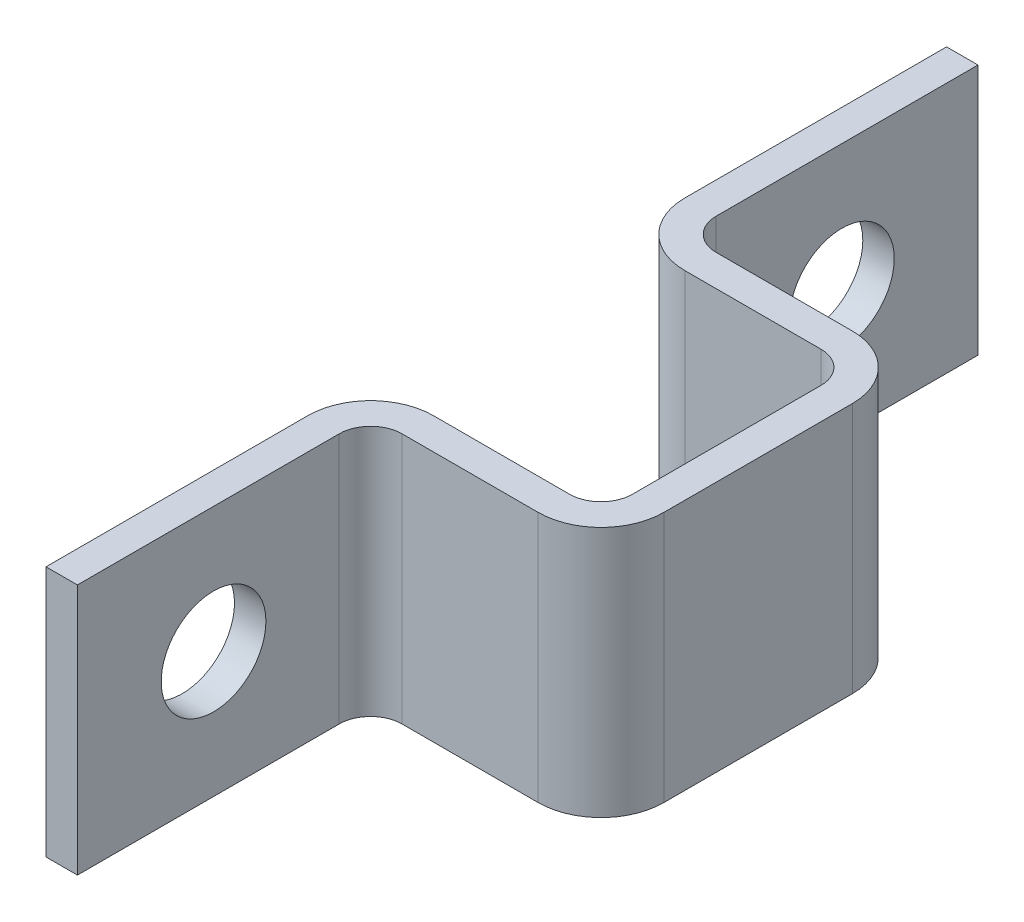
ISO-10303-21;
HEADER;
FILE_DESCRIPTION(('STEP AP214'),'2;1');
FILE_NAME('part.step','',(''),(''),'','','');
FILE_SCHEMA(('AUTOMOTIVE_DESIGN { 1 0 10303 214 1 1 1 1 }'));
ENDSEC;
DATA;
#1=APPLICATION_CONTEXT('core data for automotive mechanical design processes');
#2=APPLICATION_PROTOCOL_DEFINITION('international standard','automotive_design',2000,#1);
#3=PRODUCT_CONTEXT('',#1,'mechanical');
#4=PRODUCT('Part','Part','',(#3));
#5=PRODUCT_RELATED_PRODUCT_CATEGORY('part','',(#4));
#6=PRODUCT_DEFINITION_FORMATION('','',#4);
#7=PRODUCT_DEFINITION_CONTEXT('part definition',#1,'design');
#8=PRODUCT_DEFINITION('design','',#6,#7);
#9=PRODUCT_DEFINITION_SHAPE('','',#8);
#10=(LENGTH_UNIT() NAMED_UNIT(*) SI_UNIT(.MILLI.,.METRE.));
#11=(NAMED_UNIT(*) PLANE_ANGLE_UNIT() SI_UNIT($,.RADIAN.));
#12=(NAMED_UNIT(*) SI_UNIT($,.STERADIAN.) SOLID_ANGLE_UNIT());
#13=UNCERTAINTY_MEASURE_WITH_UNIT(LENGTH_MEASURE(1.E-05),#10,'distance_accuracy_value','');
#14=(GEOMETRIC_REPRESENTATION_CONTEXT(3) GLOBAL_UNCERTAINTY_ASSIGNED_CONTEXT((#13)) GLOBAL_UNIT_ASSIGNED_CONTEXT((#10,
#11,#12)) REPRESENTATION_CONTEXT('',''));
#15=CARTESIAN_POINT('',(0.,0.,0.));
#16=DIRECTION('',(0.,0.,1.));
#17=DIRECTION('',(1.,0.,0.));
#18=AXIS2_PLACEMENT_3D('',#15,#16,#17);
#19=CARTESIAN_POINT('',(1.5,12.,-21.5));
#20=DIRECTION('',(1.,0.,0.));
#21=DIRECTION('',(0.,0.,-1.));
#22=AXIS2_PLACEMENT_3D('',#19,#20,#21);
#23=PLANE('',#22);
#24=DIRECTION('',(0.,0.,1.));
#25=VECTOR('',#24,1.);
#26=CARTESIAN_POINT('',(1.5,0.,-21.5));
#27=LINE('',#26,#25);
#28=CARTESIAN_POINT('',(1.5,0.,-21.5));
#29=VERTEX_POINT('',#28);
#30=CARTESIAN_POINT('',(1.5,0.,-9.));
#31=VERTEX_POINT('',#30);
#32=EDGE_CURVE('E233',#29,#31,#27,.T.);
#33=ORIENTED_EDGE('',*,*,#32,.F.);
#34=DIRECTION('',(0.,-1.,0.));
#35=VECTOR('',#34,1.);
#36=CARTESIAN_POINT('',(1.5,12.,-21.5));
#37=LINE('',#36,#35);
#38=CARTESIAN_POINT('',(1.5,12.,-21.5));
#39=VERTEX_POINT('',#38);
#40=EDGE_CURVE('E269',#39,#29,#37,.T.);
#41=ORIENTED_EDGE('',*,*,#40,.F.);
#42=DIRECTION('',(0.,0.,1.));
#43=VECTOR('',#42,1.);
#44=CARTESIAN_POINT('',(1.5,12.,-21.5));
#45=LINE('',#44,#43);
#46=CARTESIAN_POINT('',(1.5,12.,-9.));
#47=VERTEX_POINT('',#46);
#48=EDGE_CURVE('E333',#39,#47,#45,.T.);
#49=ORIENTED_EDGE('',*,*,#48,.T.);
#50=DIRECTION('',(0.,-1.,0.));
#51=VECTOR('',#50,1.);
#52=CARTESIAN_POINT('',(1.5,12.,-9.));
#53=LINE('',#52,#51);
#54=EDGE_CURVE('E271',#47,#31,#53,.T.);
#55=ORIENTED_EDGE('',*,*,#54,.T.);
#56=EDGE_LOOP('',(#33,#41,#49,#55));
#57=FACE_BOUND('',#56,.T.);
#58=CARTESIAN_POINT('',(1.5,6.,-15.));
#59=DIRECTION('',(1.,0.,0.));
#60=DIRECTION('',(0.,0.,-1.));
#61=AXIS2_PLACEMENT_3D('',#58,#59,#60);
#62=CIRCLE('',#61,2.5);
#63=CARTESIAN_POINT('',(1.50000000000001,6.,-17.5));
#64=VERTEX_POINT('',#63);
#65=EDGE_CURVE('E551',#64,#64,#62,.F.);
#66=ORIENTED_EDGE('',*,*,#65,.T.);
#67=EDGE_LOOP('',(#66));
#68=FACE_BOUND('',#67,.T.);
#69=ADVANCED_FACE('F34',(#57,#68),#23,.T.);
#70=CARTESIAN_POINT('',(0.,12.,-21.5));
#71=DIRECTION('',(1.,0.,0.));
#72=DIRECTION('',(0.,0.,-1.));
#73=AXIS2_PLACEMENT_3D('',#70,#71,#72);
#74=PLANE('',#73);
#75=DIRECTION('',(0.,0.,1.));
#76=VECTOR('',#75,1.);
#77=CARTESIAN_POINT('',(0.,0.,-21.5));
#78=LINE('',#77,#76);
#79=CARTESIAN_POINT('',(0.,0.,-21.5));
#80=VERTEX_POINT('',#79);
#81=CARTESIAN_POINT('',(0.,0.,-9.));
#82=VERTEX_POINT('',#81);
#83=EDGE_CURVE('E239',#80,#82,#78,.T.);
#84=ORIENTED_EDGE('',*,*,#83,.T.);
#85=DIRECTION('',(0.,-1.,0.));
#86=VECTOR('',#85,1.);
#87=CARTESIAN_POINT('',(0.,12.,-9.));
#88=LINE('',#87,#86);
#89=CARTESIAN_POINT('',(0.,12.,-9.));
#90=VERTEX_POINT('',#89);
#91=EDGE_CURVE('E264',#90,#82,#88,.T.);
#92=ORIENTED_EDGE('',*,*,#91,.F.);
#93=DIRECTION('',(0.,0.,1.));
#94=VECTOR('',#93,1.);
#95=CARTESIAN_POINT('',(0.,12.,-21.5));
#96=LINE('',#95,#94);
#97=CARTESIAN_POINT('',(0.,12.,-21.5));
#98=VERTEX_POINT('',#97);
#99=EDGE_CURVE('E339',#98,#90,#96,.T.);
#100=ORIENTED_EDGE('',*,*,#99,.F.);
#101=DIRECTION('',(0.,-1.,0.));
#102=VECTOR('',#101,1.);
#103=CARTESIAN_POINT('',(0.,12.,-21.5));
#104=LINE('',#103,#102);
#105=EDGE_CURVE('E267',#98,#80,#104,.T.);
#106=ORIENTED_EDGE('',*,*,#105,.T.);
#107=EDGE_LOOP('',(#84,#92,#100,#106));
#108=FACE_BOUND('',#107,.T.);
#109=CARTESIAN_POINT('',(0.,6.,-15.));
#110=DIRECTION('',(1.,0.,0.));
#111=DIRECTION('',(0.,0.,-1.));
#112=AXIS2_PLACEMENT_3D('',#109,#110,#111);
#113=CIRCLE('',#112,2.5);
#114=CARTESIAN_POINT('',(0.,6.,-17.5));
#115=VERTEX_POINT('',#114);
#116=EDGE_CURVE('E554',#115,#115,#113,.T.);
#117=ORIENTED_EDGE('',*,*,#116,.T.);
#118=EDGE_LOOP('',(#117));
#119=FACE_BOUND('',#118,.T.);
#120=ADVANCED_FACE('F369',(#108,#119),#74,.F.);
#121=CARTESIAN_POINT('',(0.,12.,9.));
#122=DIRECTION('',(1.,0.,0.));
#123=DIRECTION('',(0.,0.,-1.));
#124=AXIS2_PLACEMENT_3D('',#121,#122,#123);
#125=PLANE('',#124);
#126=DIRECTION('',(0.,0.,1.));
#127=VECTOR('',#126,1.);
#128=CARTESIAN_POINT('',(0.,0.,9.));
#129=LINE('',#128,#127);
#130=CARTESIAN_POINT('',(0.,0.,9.));
#131=VERTEX_POINT('',#130);
#132=CARTESIAN_POINT('',(0.,0.,21.5));
#133=VERTEX_POINT('',#132);
#134=EDGE_CURVE('E203',#131,#133,#129,.T.);
#135=ORIENTED_EDGE('',*,*,#134,.T.);
#136=DIRECTION('',(0.,-1.,0.));
#137=VECTOR('',#136,1.);
#138=CARTESIAN_POINT('',(0.,12.,21.5));
#139=LINE('',#138,#137);
#140=CARTESIAN_POINT('',(0.,12.,21.5));
#141=VERTEX_POINT('',#140);
#142=EDGE_CURVE('E11',#141,#133,#139,.T.);
#143=ORIENTED_EDGE('',*,*,#142,.F.);
#144=DIRECTION('',(0.,0.,1.));
#145=VECTOR('',#144,1.);
#146=CARTESIAN_POINT('',(0.,12.,9.));
#147=LINE('',#146,#145);
#148=CARTESIAN_POINT('',(0.,12.,9.));
#149=VERTEX_POINT('',#148);
#150=EDGE_CURVE('E128',#149,#141,#147,.T.);
#151=ORIENTED_EDGE('',*,*,#150,.F.);
#152=DIRECTION('',(0.,-1.,0.));
#153=VECTOR('',#152,1.);
#154=CARTESIAN_POINT('',(0.,12.,9.));
#155=LINE('',#154,#153);
#156=EDGE_CURVE('E199',#149,#131,#155,.T.);
#157=ORIENTED_EDGE('',*,*,#156,.T.);
#158=EDGE_LOOP('',(#135,#143,#151,#157));
#159=FACE_BOUND('',#158,.T.);
#160=CARTESIAN_POINT('',(0.,6.,15.));
#161=DIRECTION('',(1.,0.,0.));
#162=DIRECTION('',(0.,0.,-1.));
#163=AXIS2_PLACEMENT_3D('',#160,#161,#162);
#164=CIRCLE('',#163,2.5);
#165=CARTESIAN_POINT('',(0.,6.,12.5));
#166=VERTEX_POINT('',#165);
#167=EDGE_CURVE('E557',#166,#166,#164,.T.);
#168=ORIENTED_EDGE('',*,*,#167,.T.);
#169=EDGE_LOOP('',(#168));
#170=FACE_BOUND('',#169,.T.);
#171=ADVANCED_FACE('F36',(#159,#170),#125,.F.);
#172=CARTESIAN_POINT('',(1.5,12.,9.));
#173=DIRECTION('',(1.,0.,0.));
#174=DIRECTION('',(0.,0.,-1.));
#175=AXIS2_PLACEMENT_3D('',#172,#173,#174);
#176=PLANE('',#175);
#177=DIRECTION('',(0.,0.,1.));
#178=VECTOR('',#177,1.);
#179=CARTESIAN_POINT('',(1.5,0.,9.));
#180=LINE('',#179,#178);
#181=CARTESIAN_POINT('',(1.5,0.,9.));
#182=VERTEX_POINT('',#181);
#183=CARTESIAN_POINT('',(1.5,0.,21.5));
#184=VERTEX_POINT('',#183);
#185=EDGE_CURVE('E209',#182,#184,#180,.T.);
#186=ORIENTED_EDGE('',*,*,#185,.F.);
#187=DIRECTION('',(0.,-1.,0.));
#188=VECTOR('',#187,1.);
#189=CARTESIAN_POINT('',(1.5,12.,9.));
#190=LINE('',#189,#188);
#191=CARTESIAN_POINT('',(1.5,12.,9.));
#192=VERTEX_POINT('',#191);
#193=EDGE_CURVE('E285',#192,#182,#190,.T.);
#194=ORIENTED_EDGE('',*,*,#193,.F.);
#195=DIRECTION('',(0.,0.,1.));
#196=VECTOR('',#195,1.);
#197=CARTESIAN_POINT('',(1.5,12.,9.));
#198=LINE('',#197,#196);
#199=CARTESIAN_POINT('',(1.5,12.,21.5));
#200=VERTEX_POINT('',#199);
#201=EDGE_CURVE('E294',#192,#200,#198,.T.);
#202=ORIENTED_EDGE('',*,*,#201,.T.);
#203=DIRECTION('',(0.,-1.,0.));
#204=VECTOR('',#203,1.);
#205=CARTESIAN_POINT('',(1.5,12.,21.5));
#206=LINE('',#205,#204);
#207=EDGE_CURVE('E44',#200,#184,#206,.T.);
#208=ORIENTED_EDGE('',*,*,#207,.T.);
#209=EDGE_LOOP('',(#186,#194,#202,#208));
#210=FACE_BOUND('',#209,.T.);
#211=CARTESIAN_POINT('',(1.5,6.,15.));
#212=DIRECTION('',(1.,0.,0.));
#213=DIRECTION('',(0.,0.,-1.));
#214=AXIS2_PLACEMENT_3D('',#211,#212,#213);
#215=CIRCLE('',#214,2.5);
#216=CARTESIAN_POINT('',(1.5,6.,12.5));
#217=VERTEX_POINT('',#216);
#218=EDGE_CURVE('E38',#217,#217,#215,.F.);
#219=ORIENTED_EDGE('',*,*,#218,.T.);
#220=EDGE_LOOP('',(#219));
#221=FACE_BOUND('',#220,.T.);
#222=ADVANCED_FACE('F291',(#210,#221),#176,.T.);
#223=CARTESIAN_POINT('',(1.5,12.,21.5));
#224=DIRECTION('',(0.,0.,1.));
#225=DIRECTION('',(1.,0.,0.));
#226=AXIS2_PLACEMENT_3D('',#223,#224,#225);
#227=PLANE('',#226);
#228=DIRECTION('',(-1.,0.,0.));
#229=VECTOR('',#228,1.);
#230=CARTESIAN_POINT('',(1.5,0.,21.5));
#231=LINE('',#230,#229);
#232=EDGE_CURVE('E206',#184,#133,#231,.T.);
#233=ORIENTED_EDGE('',*,*,#232,.F.);
#234=ORIENTED_EDGE('',*,*,#207,.F.);
#235=DIRECTION('',(-1.,0.,0.));
#236=VECTOR('',#235,1.);
#237=CARTESIAN_POINT('',(1.5,12.,21.5));
#238=LINE('',#237,#236);
#239=EDGE_CURVE('E310',#200,#141,#238,.T.);
#240=ORIENTED_EDGE('',*,*,#239,.T.);
#241=ORIENTED_EDGE('',*,*,#142,.T.);
#242=EDGE_LOOP('',(#233,#234,#240,#241));
#243=FACE_BOUND('',#242,.T.);
#244=ADVANCED_FACE('F297',(#243),#227,.T.);
#245=CARTESIAN_POINT('',(3.,12.,9.));
#246=DIRECTION('',(0.,-1.,0.));
#247=DIRECTION('',(0.,0.,-1.));
#248=AXIS2_PLACEMENT_3D('',#245,#246,#247);
#249=CYLINDRICAL_SURFACE('',#248,1.5);
#250=CARTESIAN_POINT('',(3.,0.,9.));
#251=DIRECTION('',(0.,1.,0.));
#252=DIRECTION('',(1.,0.,0.));
#253=AXIS2_PLACEMENT_3D('',#250,#251,#252);
#254=CIRCLE('',#253,1.5);
#255=CARTESIAN_POINT('',(3.,0.,7.5));
#256=VERTEX_POINT('',#255);
#257=EDGE_CURVE('E212',#256,#182,#254,.T.);
#258=ORIENTED_EDGE('',*,*,#257,.F.);
#259=DIRECTION('',(0.,-1.,0.));
#260=VECTOR('',#259,1.);
#261=CARTESIAN_POINT('',(3.,12.,7.5));
#262=LINE('',#261,#260);
#263=CARTESIAN_POINT('',(3.,12.,7.5));
#264=VERTEX_POINT('',#263);
#265=EDGE_CURVE('E283',#264,#256,#262,.T.);
#266=ORIENTED_EDGE('',*,*,#265,.F.);
#267=CARTESIAN_POINT('',(3.,12.,9.));
#268=DIRECTION('',(0.,1.,0.));
#269=DIRECTION('',(1.,0.,0.));
#270=AXIS2_PLACEMENT_3D('',#267,#268,#269);
#271=CIRCLE('',#270,1.5);
#272=EDGE_CURVE('E307',#264,#192,#271,.T.);
#273=ORIENTED_EDGE('',*,*,#272,.T.);
#274=ORIENTED_EDGE('',*,*,#193,.T.);
#275=EDGE_LOOP('',(#258,#266,#273,#274));
#276=FACE_BOUND('',#275,.T.);
#277=ADVANCED_FACE('F304',(#276),#249,.F.);
#278=CARTESIAN_POINT('',(9.5,12.,7.5));
#279=DIRECTION('',(0.,0.,1.));
#280=DIRECTION('',(1.,0.,0.));
#281=AXIS2_PLACEMENT_3D('',#278,#279,#280);
#282=PLANE('',#281);
#283=DIRECTION('',(1.,0.,0.));
#284=VECTOR('',#283,1.);
#285=CARTESIAN_POINT('',(9.5,0.,7.5));
#286=LINE('',#285,#284);
#287=CARTESIAN_POINT('',(9.5,0.,7.5));
#288=VERTEX_POINT('',#287);
#289=EDGE_CURVE('E215',#288,#256,#286,.F.);
#290=ORIENTED_EDGE('',*,*,#289,.F.);
#291=DIRECTION('',(0.,-1.,0.));
#292=VECTOR('',#291,1.);
#293=CARTESIAN_POINT('',(9.5,12.,7.5));
#294=LINE('',#293,#292);
#295=CARTESIAN_POINT('',(9.5,12.,7.5));
#296=VERTEX_POINT('',#295);
#297=EDGE_CURVE('E281',#296,#288,#294,.T.);
#298=ORIENTED_EDGE('',*,*,#297,.F.);
#299=DIRECTION('',(1.,0.,0.));
#300=VECTOR('',#299,1.);
#301=CARTESIAN_POINT('',(9.5,12.,7.5));
#302=LINE('',#301,#300);
#303=EDGE_CURVE('E312',#296,#264,#302,.F.);
#304=ORIENTED_EDGE('',*,*,#303,.T.);
#305=ORIENTED_EDGE('',*,*,#265,.T.);
#306=EDGE_LOOP('',(#290,#298,#304,#305));
#307=FACE_BOUND('',#306,.T.);
#308=ADVANCED_FACE('F401',(#307),#282,.T.);
#309=CARTESIAN_POINT('',(9.5,12.,4.5));
#310=DIRECTION('',(0.,-1.,0.));
#311=DIRECTION('',(0.,0.,-1.));
#312=AXIS2_PLACEMENT_3D('',#309,#310,#311);
#313=CYLINDRICAL_SURFACE('',#312,3.);
#314=CARTESIAN_POINT('',(9.5,0.,4.5));
#315=DIRECTION('',(0.,1.,0.));
#316=DIRECTION('',(1.,0.,0.));
#317=AXIS2_PLACEMENT_3D('',#314,#315,#316);
#318=CIRCLE('',#317,3.);
#319=CARTESIAN_POINT('',(12.5,0.,4.5));
#320=VERTEX_POINT('',#319);
#321=EDGE_CURVE('E218',#320,#288,#318,.F.);
#322=ORIENTED_EDGE('',*,*,#321,.F.);
#323=DIRECTION('',(0.,-1.,0.));
#324=VECTOR('',#323,1.);
#325=CARTESIAN_POINT('',(12.5,12.,4.5));
#326=LINE('',#325,#324);
#327=CARTESIAN_POINT('',(12.5,12.,4.5));
#328=VERTEX_POINT('',#327);
#329=EDGE_CURVE('E279',#328,#320,#326,.T.);
#330=ORIENTED_EDGE('',*,*,#329,.F.);
#331=CARTESIAN_POINT('',(9.5,12.,4.5));
#332=DIRECTION('',(0.,1.,0.));
#333=DIRECTION('',(1.,0.,0.));
#334=AXIS2_PLACEMENT_3D('',#331,#332,#333);
#335=CIRCLE('',#334,3.);
#336=EDGE_CURVE('E318',#328,#296,#335,.F.);
#337=ORIENTED_EDGE('',*,*,#336,.T.);
#338=ORIENTED_EDGE('',*,*,#297,.T.);
#339=EDGE_LOOP('',(#322,#330,#337,#338));
#340=FACE_BOUND('',#339,.T.);
#341=ADVANCED_FACE('F397',(#340),#313,.T.);
#342=CARTESIAN_POINT('',(12.5,12.,-4.5));
#343=DIRECTION('',(1.,0.,0.));
#344=DIRECTION('',(0.,0.,-1.));
#345=AXIS2_PLACEMENT_3D('',#342,#343,#344);
#346=PLANE('',#345);
#347=DIRECTION('',(0.,0.,-1.));
#348=VECTOR('',#347,1.);
#349=CARTESIAN_POINT('',(12.5,0.,-4.5));
#350=LINE('',#349,#348);
#351=CARTESIAN_POINT('',(12.5,0.,-4.5));
#352=VERTEX_POINT('',#351);
#353=EDGE_CURVE('E221',#352,#320,#350,.F.);
#354=ORIENTED_EDGE('',*,*,#353,.F.);
#355=DIRECTION('',(0.,-1.,0.));
#356=VECTOR('',#355,1.);
#357=CARTESIAN_POINT('',(12.5,12.,-4.5));
#358=LINE('',#357,#356);
#359=CARTESIAN_POINT('',(12.5,12.,-4.5));
#360=VERTEX_POINT('',#359);
#361=EDGE_CURVE('E277',#360,#352,#358,.T.);
#362=ORIENTED_EDGE('',*,*,#361,.F.);
#363=DIRECTION('',(0.,0.,-1.));
#364=VECTOR('',#363,1.);
#365=CARTESIAN_POINT('',(12.5,12.,-4.5));
#366=LINE('',#365,#364);
#367=EDGE_CURVE('E321',#360,#328,#366,.F.);
#368=ORIENTED_EDGE('',*,*,#367,.T.);
#369=ORIENTED_EDGE('',*,*,#329,.T.);
#370=EDGE_LOOP('',(#354,#362,#368,#369));
#371=FACE_BOUND('',#370,.T.);
#372=ADVANCED_FACE('F393',(#371),#346,.T.);
#373=CARTESIAN_POINT('',(9.5,12.,-4.5));
#374=DIRECTION('',(0.,-1.,0.));
#375=DIRECTION('',(0.,0.,-1.));
#376=AXIS2_PLACEMENT_3D('',#373,#374,#375);
#377=CYLINDRICAL_SURFACE('',#376,3.);
#378=CARTESIAN_POINT('',(9.5,0.,-4.5));
#379=DIRECTION('',(0.,1.,0.));
#380=DIRECTION('',(1.,0.,0.));
#381=AXIS2_PLACEMENT_3D('',#378,#379,#380);
#382=CIRCLE('',#381,3.);
#383=CARTESIAN_POINT('',(9.5,0.,-7.5));
#384=VERTEX_POINT('',#383);
#385=EDGE_CURVE('E224',#384,#352,#382,.F.);
#386=ORIENTED_EDGE('',*,*,#385,.F.);
#387=DIRECTION('',(0.,-1.,0.));
#388=VECTOR('',#387,1.);
#389=CARTESIAN_POINT('',(9.5,12.,-7.5));
#390=LINE('',#389,#388);
#391=CARTESIAN_POINT('',(9.5,12.,-7.5));
#392=VERTEX_POINT('',#391);
#393=EDGE_CURVE('E275',#392,#384,#390,.T.);
#394=ORIENTED_EDGE('',*,*,#393,.F.);
#395=CARTESIAN_POINT('',(9.5,12.,-4.5));
#396=DIRECTION('',(0.,1.,0.));
#397=DIRECTION('',(1.,0.,0.));
#398=AXIS2_PLACEMENT_3D('',#395,#396,#397);
#399=CIRCLE('',#398,3.);
#400=EDGE_CURVE('E324',#392,#360,#399,.F.);
#401=ORIENTED_EDGE('',*,*,#400,.T.);
#402=ORIENTED_EDGE('',*,*,#361,.T.);
#403=EDGE_LOOP('',(#386,#394,#401,#402));
#404=FACE_BOUND('',#403,.T.);
#405=ADVANCED_FACE('F389',(#404),#377,.T.);
#406=CARTESIAN_POINT('',(3.,12.,-7.5));
#407=DIRECTION('',(0.,0.,-1.));
#408=DIRECTION('',(-1.,0.,0.));
#409=AXIS2_PLACEMENT_3D('',#406,#407,#408);
#410=PLANE('',#409);
#411=DIRECTION('',(1.,0.,0.));
#412=VECTOR('',#411,1.);
#413=CARTESIAN_POINT('',(3.,0.,-7.5));
#414=LINE('',#413,#412);
#415=CARTESIAN_POINT('',(3.,0.,-7.5));
#416=VERTEX_POINT('',#415);
#417=EDGE_CURVE('E227',#416,#384,#414,.T.);
#418=ORIENTED_EDGE('',*,*,#417,.F.);
#419=DIRECTION('',(0.,-1.,0.));
#420=VECTOR('',#419,1.);
#421=CARTESIAN_POINT('',(3.,12.,-7.5));
#422=LINE('',#421,#420);
#423=CARTESIAN_POINT('',(3.,12.,-7.5));
#424=VERTEX_POINT('',#423);
#425=EDGE_CURVE('E273',#424,#416,#422,.T.);
#426=ORIENTED_EDGE('',*,*,#425,.F.);
#427=DIRECTION('',(1.,0.,0.));
#428=VECTOR('',#427,1.);
#429=CARTESIAN_POINT('',(3.,12.,-7.5));
#430=LINE('',#429,#428);
#431=EDGE_CURVE('E327',#424,#392,#430,.T.);
#432=ORIENTED_EDGE('',*,*,#431,.T.);
#433=ORIENTED_EDGE('',*,*,#393,.T.);
#434=EDGE_LOOP('',(#418,#426,#432,#433));
#435=FACE_BOUND('',#434,.T.);
#436=ADVANCED_FACE('F385',(#435),#410,.T.);
#437=CARTESIAN_POINT('',(3.,12.,-9.));
#438=DIRECTION('',(0.,-1.,0.));
#439=DIRECTION('',(0.,0.,-1.));
#440=AXIS2_PLACEMENT_3D('',#437,#438,#439);
#441=CYLINDRICAL_SURFACE('',#440,1.5);
#442=CARTESIAN_POINT('',(3.,0.,-9.));
#443=DIRECTION('',(0.,1.,0.));
#444=DIRECTION('',(1.,0.,0.));
#445=AXIS2_PLACEMENT_3D('',#442,#443,#444);
#446=CIRCLE('',#445,1.5);
#447=EDGE_CURVE('E230',#31,#416,#446,.T.);
#448=ORIENTED_EDGE('',*,*,#447,.F.);
#449=ORIENTED_EDGE('',*,*,#54,.F.);
#450=CARTESIAN_POINT('',(3.,12.,-9.));
#451=DIRECTION('',(0.,1.,0.));
#452=DIRECTION('',(1.,0.,0.));
#453=AXIS2_PLACEMENT_3D('',#450,#451,#452);
#454=CIRCLE('',#453,1.5);
#455=EDGE_CURVE('E330',#47,#424,#454,.T.);
#456=ORIENTED_EDGE('',*,*,#455,.T.);
#457=ORIENTED_EDGE('',*,*,#425,.T.);
#458=EDGE_LOOP('',(#448,#449,#456,#457));
#459=FACE_BOUND('',#458,.T.);
#460=ADVANCED_FACE('F382',(#459),#441,.F.);
#461=CARTESIAN_POINT('',(0.,12.,-21.5));
#462=DIRECTION('',(0.,0.,-1.));
#463=DIRECTION('',(-1.,0.,0.));
#464=AXIS2_PLACEMENT_3D('',#461,#462,#463);
#465=PLANE('',#464);
#466=DIRECTION('',(1.,0.,0.));
#467=VECTOR('',#466,1.);
#468=CARTESIAN_POINT('',(0.,0.,-21.5));
#469=LINE('',#468,#467);
#470=EDGE_CURVE('E236',#80,#29,#469,.T.);
#471=ORIENTED_EDGE('',*,*,#470,.F.);
#472=ORIENTED_EDGE('',*,*,#105,.F.);
#473=DIRECTION('',(1.,0.,0.));
#474=VECTOR('',#473,1.);
#475=CARTESIAN_POINT('',(0.,12.,-21.5));
#476=LINE('',#475,#474);
#477=EDGE_CURVE('E336',#98,#39,#476,.T.);
#478=ORIENTED_EDGE('',*,*,#477,.T.);
#479=ORIENTED_EDGE('',*,*,#40,.T.);
#480=EDGE_LOOP('',(#471,#472,#478,#479));
#481=FACE_BOUND('',#480,.T.);
#482=ADVANCED_FACE('F381',(#481),#465,.T.);
#483=CARTESIAN_POINT('',(3.,12.,-9.));
#484=DIRECTION('',(0.,-1.,0.));
#485=DIRECTION('',(0.,0.,-1.));
#486=AXIS2_PLACEMENT_3D('',#483,#484,#485);
#487=CYLINDRICAL_SURFACE('',#486,3.);
#488=CARTESIAN_POINT('',(3.,0.,-9.));
#489=DIRECTION('',(0.,1.,0.));
#490=DIRECTION('',(0.,0.,1.));
#491=AXIS2_PLACEMENT_3D('',#488,#489,#490);
#492=CIRCLE('',#491,3.);
#493=CARTESIAN_POINT('',(3.,0.,-6.));
#494=VERTEX_POINT('',#493);
#495=EDGE_CURVE('E241',#82,#494,#492,.T.);
#496=ORIENTED_EDGE('',*,*,#495,.T.);
#497=DIRECTION('',(0.,-1.,0.));
#498=VECTOR('',#497,1.);
#499=CARTESIAN_POINT('',(3.,12.,-6.));
#500=LINE('',#499,#498);
#501=CARTESIAN_POINT('',(3.,12.,-6.));
#502=VERTEX_POINT('',#501);
#503=EDGE_CURVE('E261',#502,#494,#500,.T.);
#504=ORIENTED_EDGE('',*,*,#503,.F.);
#505=CARTESIAN_POINT('',(3.,12.,-9.));
#506=DIRECTION('',(0.,1.,0.));
#507=DIRECTION('',(0.,0.,1.));
#508=AXIS2_PLACEMENT_3D('',#505,#506,#507);
#509=CIRCLE('',#508,3.);
#510=EDGE_CURVE('E341',#90,#502,#509,.T.);
#511=ORIENTED_EDGE('',*,*,#510,.F.);
#512=ORIENTED_EDGE('',*,*,#91,.T.);
#513=EDGE_LOOP('',(#496,#504,#511,#512));
#514=FACE_BOUND('',#513,.T.);
#515=ADVANCED_FACE('F449',(#514),#487,.T.);
#516=CARTESIAN_POINT('',(3.,12.,-6.));
#517=DIRECTION('',(0.,0.,-1.));
#518=DIRECTION('',(-1.,0.,0.));
#519=AXIS2_PLACEMENT_3D('',#516,#517,#518);
#520=PLANE('',#519);
#521=DIRECTION('',(1.,0.,0.));
#522=VECTOR('',#521,1.);
#523=CARTESIAN_POINT('',(3.,0.,-6.));
#524=LINE('',#523,#522);
#525=CARTESIAN_POINT('',(9.5,0.,-6.));
#526=VERTEX_POINT('',#525);
#527=EDGE_CURVE('E243',#494,#526,#524,.T.);
#528=ORIENTED_EDGE('',*,*,#527,.T.);
#529=DIRECTION('',(0.,-1.,0.));
#530=VECTOR('',#529,1.);
#531=CARTESIAN_POINT('',(9.5,12.,-6.));
#532=LINE('',#531,#530);
#533=CARTESIAN_POINT('',(9.5,12.,-6.));
#534=VERTEX_POINT('',#533);
#535=EDGE_CURVE('E258',#534,#526,#532,.T.);
#536=ORIENTED_EDGE('',*,*,#535,.F.);
#537=DIRECTION('',(1.,0.,0.));
#538=VECTOR('',#537,1.);
#539=CARTESIAN_POINT('',(3.,12.,-6.));
#540=LINE('',#539,#538);
#541=EDGE_CURVE('E343',#502,#534,#540,.T.);
#542=ORIENTED_EDGE('',*,*,#541,.F.);
#543=ORIENTED_EDGE('',*,*,#503,.T.);
#544=EDGE_LOOP('',(#528,#536,#542,#543));
#545=FACE_BOUND('',#544,.T.);
#546=ADVANCED_FACE('F456',(#545),#520,.F.);
#547=CARTESIAN_POINT('',(9.5,12.,-4.5));
#548=DIRECTION('',(0.,-1.,0.));
#549=DIRECTION('',(0.,0.,-1.));
#550=AXIS2_PLACEMENT_3D('',#547,#548,#549);
#551=CYLINDRICAL_SURFACE('',#550,1.5);
#552=CARTESIAN_POINT('',(9.5,0.,-4.5));
#553=DIRECTION('',(0.,-1.,0.));
#554=DIRECTION('',(0.,0.,-1.));
#555=AXIS2_PLACEMENT_3D('',#552,#553,#554);
#556=CIRCLE('',#555,1.5);
#557=CARTESIAN_POINT('',(11.,0.,-4.5));
#558=VERTEX_POINT('',#557);
#559=EDGE_CURVE('E245',#526,#558,#556,.T.);
#560=ORIENTED_EDGE('',*,*,#559,.T.);
#561=DIRECTION('',(0.,-1.,0.));
#562=VECTOR('',#561,1.);
#563=CARTESIAN_POINT('',(11.,12.,-4.5));
#564=LINE('',#563,#562);
#565=CARTESIAN_POINT('',(11.,12.,-4.5));
#566=VERTEX_POINT('',#565);
#567=EDGE_CURVE('E255',#566,#558,#564,.T.);
#568=ORIENTED_EDGE('',*,*,#567,.F.);
#569=CARTESIAN_POINT('',(9.5,12.,-4.5));
#570=DIRECTION('',(0.,-1.,0.));
#571=DIRECTION('',(0.,0.,-1.));
#572=AXIS2_PLACEMENT_3D('',#569,#570,#571);
#573=CIRCLE('',#572,1.5);
#574=EDGE_CURVE('E345',#534,#566,#573,.T.);
#575=ORIENTED_EDGE('',*,*,#574,.F.);
#576=ORIENTED_EDGE('',*,*,#535,.T.);
#577=EDGE_LOOP('',(#560,#568,#575,#576));
#578=FACE_BOUND('',#577,.T.);
#579=ADVANCED_FACE('F351',(#578),#551,.F.);
#580=CARTESIAN_POINT('',(11.,12.,-4.5));
#581=DIRECTION('',(1.,0.,0.));
#582=DIRECTION('',(0.,0.,-1.));
#583=AXIS2_PLACEMENT_3D('',#580,#581,#582);
#584=PLANE('',#583);
#585=DIRECTION('',(0.,0.,1.));
#586=VECTOR('',#585,1.);
#587=CARTESIAN_POINT('',(11.,0.,-4.5));
#588=LINE('',#587,#586);
#589=CARTESIAN_POINT('',(11.,0.,4.5));
#590=VERTEX_POINT('',#589);
#591=EDGE_CURVE('E247',#558,#590,#588,.T.);
#592=ORIENTED_EDGE('',*,*,#591,.T.);
#593=DIRECTION('',(0.,-1.,0.));
#594=VECTOR('',#593,1.);
#595=CARTESIAN_POINT('',(11.,12.,4.5));
#596=LINE('',#595,#594);
#597=CARTESIAN_POINT('',(11.,12.,4.5));
#598=VERTEX_POINT('',#597);
#599=EDGE_CURVE('E194',#598,#590,#596,.T.);
#600=ORIENTED_EDGE('',*,*,#599,.F.);
#601=DIRECTION('',(0.,0.,1.));
#602=VECTOR('',#601,1.);
#603=CARTESIAN_POINT('',(11.,12.,-4.5));
#604=LINE('',#603,#602);
#605=EDGE_CURVE('E185',#566,#598,#604,.T.);
#606=ORIENTED_EDGE('',*,*,#605,.F.);
#607=ORIENTED_EDGE('',*,*,#567,.T.);
#608=EDGE_LOOP('',(#592,#600,#606,#607));
#609=FACE_BOUND('',#608,.T.);
#610=ADVANCED_FACE('F355',(#609),#584,.F.);
#611=CARTESIAN_POINT('',(9.5,12.,4.5));
#612=DIRECTION('',(0.,-1.,0.));
#613=DIRECTION('',(0.,0.,-1.));
#614=AXIS2_PLACEMENT_3D('',#611,#612,#613);
#615=CYLINDRICAL_SURFACE('',#614,1.5);
#616=CARTESIAN_POINT('',(9.5,0.,4.5));
#617=DIRECTION('',(0.,-1.,0.));
#618=DIRECTION('',(0.,0.,1.));
#619=AXIS2_PLACEMENT_3D('',#616,#617,#618);
#620=CIRCLE('',#619,1.5);
#621=CARTESIAN_POINT('',(9.5,0.,6.));
#622=VERTEX_POINT('',#621);
#623=EDGE_CURVE('E193',#590,#622,#620,.T.);
#624=ORIENTED_EDGE('',*,*,#623,.T.);
#625=DIRECTION('',(0.,-1.,0.));
#626=VECTOR('',#625,1.);
#627=CARTESIAN_POINT('',(9.5,12.,6.));
#628=LINE('',#627,#626);
#629=CARTESIAN_POINT('',(9.5,12.,6.));
#630=VERTEX_POINT('',#629);
#631=EDGE_CURVE('E190',#630,#622,#628,.T.);
#632=ORIENTED_EDGE('',*,*,#631,.F.);
#633=CARTESIAN_POINT('',(9.5,12.,4.5));
#634=DIRECTION('',(0.,-1.,0.));
#635=DIRECTION('',(0.,0.,1.));
#636=AXIS2_PLACEMENT_3D('',#633,#634,#635);
#637=CIRCLE('',#636,1.5);
#638=EDGE_CURVE('E179',#598,#630,#637,.T.);
#639=ORIENTED_EDGE('',*,*,#638,.F.);
#640=ORIENTED_EDGE('',*,*,#599,.T.);
#641=EDGE_LOOP('',(#624,#632,#639,#640));
#642=FACE_BOUND('',#641,.T.);
#643=ADVANCED_FACE('F191',(#642),#615,.F.);
#644=CARTESIAN_POINT('',(9.5,12.,6.));
#645=DIRECTION('',(0.,0.,1.));
#646=DIRECTION('',(1.,0.,0.));
#647=AXIS2_PLACEMENT_3D('',#644,#645,#646);
#648=PLANE('',#647);
#649=DIRECTION('',(-1.,0.,0.));
#650=VECTOR('',#649,1.);
#651=CARTESIAN_POINT('',(9.5,0.,6.));
#652=LINE('',#651,#650);
#653=CARTESIAN_POINT('',(3.,0.,6.));
#654=VERTEX_POINT('',#653);
#655=EDGE_CURVE('E116',#622,#654,#652,.T.);
#656=ORIENTED_EDGE('',*,*,#655,.T.);
#657=DIRECTION('',(0.,-1.,0.));
#658=VECTOR('',#657,1.);
#659=CARTESIAN_POINT('',(3.,12.,6.));
#660=LINE('',#659,#658);
#661=CARTESIAN_POINT('',(3.,12.,6.));
#662=VERTEX_POINT('',#661);
#663=EDGE_CURVE('E195',#662,#654,#660,.T.);
#664=ORIENTED_EDGE('',*,*,#663,.F.);
#665=DIRECTION('',(-1.,0.,0.));
#666=VECTOR('',#665,1.);
#667=CARTESIAN_POINT('',(9.5,12.,6.));
#668=LINE('',#667,#666);
#669=EDGE_CURVE('E183',#630,#662,#668,.T.);
#670=ORIENTED_EDGE('',*,*,#669,.F.);
#671=ORIENTED_EDGE('',*,*,#631,.T.);
#672=EDGE_LOOP('',(#656,#664,#670,#671));
#673=FACE_BOUND('',#672,.T.);
#674=ADVANCED_FACE('F197',(#673),#648,.F.);
#675=CARTESIAN_POINT('',(3.,12.,9.));
#676=DIRECTION('',(0.,-1.,0.));
#677=DIRECTION('',(0.,0.,-1.));
#678=AXIS2_PLACEMENT_3D('',#675,#676,#677);
#679=CYLINDRICAL_SURFACE('',#678,3.);
#680=CARTESIAN_POINT('',(3.,0.,9.));
#681=DIRECTION('',(0.,1.,0.));
#682=DIRECTION('',(0.,0.,1.));
#683=AXIS2_PLACEMENT_3D('',#680,#681,#682);
#684=CIRCLE('',#683,3.);
#685=EDGE_CURVE('E122',#654,#131,#684,.T.);
#686=ORIENTED_EDGE('',*,*,#685,.T.);
#687=ORIENTED_EDGE('',*,*,#156,.F.);
#688=CARTESIAN_POINT('',(3.,12.,9.));
#689=DIRECTION('',(0.,1.,0.));
#690=DIRECTION('',(0.,0.,1.));
#691=AXIS2_PLACEMENT_3D('',#688,#689,#690);
#692=CIRCLE('',#691,3.);
#693=EDGE_CURVE('E52',#662,#149,#692,.T.);
#694=ORIENTED_EDGE('',*,*,#693,.F.);
#695=ORIENTED_EDGE('',*,*,#663,.T.);
#696=EDGE_LOOP('',(#686,#687,#694,#695));
#697=FACE_BOUND('',#696,.T.);
#698=ADVANCED_FACE('F358',(#697),#679,.T.);
#699=CARTESIAN_POINT('',(3.,12.,9.));
#700=DIRECTION('',(0.,1.,0.));
#701=DIRECTION('',(1.,0.,0.));
#702=AXIS2_PLACEMENT_3D('',#699,#700,#701);
#703=PLANE('',#702);
#704=ORIENTED_EDGE('',*,*,#150,.T.);
#705=ORIENTED_EDGE('',*,*,#239,.F.);
#706=ORIENTED_EDGE('',*,*,#201,.F.);
#707=ORIENTED_EDGE('',*,*,#272,.F.);
#708=ORIENTED_EDGE('',*,*,#303,.F.);
#709=ORIENTED_EDGE('',*,*,#336,.F.);
#710=ORIENTED_EDGE('',*,*,#367,.F.);
#711=ORIENTED_EDGE('',*,*,#400,.F.);
#712=ORIENTED_EDGE('',*,*,#431,.F.);
#713=ORIENTED_EDGE('',*,*,#455,.F.);
#714=ORIENTED_EDGE('',*,*,#48,.F.);
#715=ORIENTED_EDGE('',*,*,#477,.F.);
#716=ORIENTED_EDGE('',*,*,#99,.T.);
#717=ORIENTED_EDGE('',*,*,#510,.T.);
#718=ORIENTED_EDGE('',*,*,#541,.T.);
#719=ORIENTED_EDGE('',*,*,#574,.T.);
#720=ORIENTED_EDGE('',*,*,#605,.T.);
#721=ORIENTED_EDGE('',*,*,#638,.T.);
#722=ORIENTED_EDGE('',*,*,#669,.T.);
#723=ORIENTED_EDGE('',*,*,#693,.T.);
#724=EDGE_LOOP('',(#704,#705,#706,#707,#708,#709,#710,#711,#712,#713,#714,#715,#716,#717,#718,
#719,#720,#721,#722,#723));
#725=FACE_BOUND('',#724,.T.);
#726=ADVANCED_FACE('F181',(#725),#703,.T.);
#727=CARTESIAN_POINT('',(3.,0.,9.));
#728=DIRECTION('',(0.,1.,0.));
#729=DIRECTION('',(1.,0.,0.));
#730=AXIS2_PLACEMENT_3D('',#727,#728,#729);
#731=PLANE('',#730);
#732=ORIENTED_EDGE('',*,*,#134,.F.);
#733=ORIENTED_EDGE('',*,*,#685,.F.);
#734=ORIENTED_EDGE('',*,*,#655,.F.);
#735=ORIENTED_EDGE('',*,*,#623,.F.);
#736=ORIENTED_EDGE('',*,*,#591,.F.);
#737=ORIENTED_EDGE('',*,*,#559,.F.);
#738=ORIENTED_EDGE('',*,*,#527,.F.);
#739=ORIENTED_EDGE('',*,*,#495,.F.);
#740=ORIENTED_EDGE('',*,*,#83,.F.);
#741=ORIENTED_EDGE('',*,*,#470,.T.);
#742=ORIENTED_EDGE('',*,*,#32,.T.);
#743=ORIENTED_EDGE('',*,*,#447,.T.);
#744=ORIENTED_EDGE('',*,*,#417,.T.);
#745=ORIENTED_EDGE('',*,*,#385,.T.);
#746=ORIENTED_EDGE('',*,*,#353,.T.);
#747=ORIENTED_EDGE('',*,*,#321,.T.);
#748=ORIENTED_EDGE('',*,*,#289,.T.);
#749=ORIENTED_EDGE('',*,*,#257,.T.);
#750=ORIENTED_EDGE('',*,*,#185,.T.);
#751=ORIENTED_EDGE('',*,*,#232,.T.);
#752=EDGE_LOOP('',(#732,#733,#734,#735,#736,#737,#738,#739,#740,#741,#742,#743,#744,#745,#746,
#747,#748,#749,#750,#751));
#753=FACE_BOUND('',#752,.T.);
#754=ADVANCED_FACE('F300',(#753),#731,.F.);
#755=CARTESIAN_POINT('',(12.5,6.,15.));
#756=DIRECTION('',(-1.,0.,0.));
#757=DIRECTION('',(0.,0.,1.));
#758=AXIS2_PLACEMENT_3D('',#755,#756,#757);
#759=CYLINDRICAL_SURFACE('',#758,2.5);
#760=ORIENTED_EDGE('',*,*,#218,.F.);
#761=EDGE_LOOP('',(#760));
#762=FACE_BOUND('',#761,.T.);
#763=ORIENTED_EDGE('',*,*,#167,.F.);
#764=EDGE_LOOP('',(#763));
#765=FACE_BOUND('',#764,.T.);
#766=ADVANCED_FACE('F505',(#762,#765),#759,.F.);
#767=CARTESIAN_POINT('',(12.5,6.,-15.));
#768=DIRECTION('',(-1.,0.,0.));
#769=DIRECTION('',(0.,0.,1.));
#770=AXIS2_PLACEMENT_3D('',#767,#768,#769);
#771=CYLINDRICAL_SURFACE('',#770,2.5);
#772=ORIENTED_EDGE('',*,*,#65,.F.);
#773=EDGE_LOOP('',(#772));
#774=FACE_BOUND('',#773,.T.);
#775=ORIENTED_EDGE('',*,*,#116,.F.);
#776=EDGE_LOOP('',(#775));
#777=FACE_BOUND('',#776,.T.);
#778=ADVANCED_FACE('F534',(#774,#777),#771,.F.);
#779=CLOSED_SHELL('',(#69,#120,#171,#222,#244,#277,#308,#341,#372,#405,#436,#460,#482,#515,#546,
#579,#610,#643,#674,#698,#726,#754,#766,#778));
#780=MANIFOLD_SOLID_BREP('B2',#779);
#781=ADVANCED_BREP_SHAPE_REPRESENTATION('',(#18,#780),#14);
#782=SHAPE_DEFINITION_REPRESENTATION(#9,#781);
ENDSEC;
END-ISO-10303-21;
